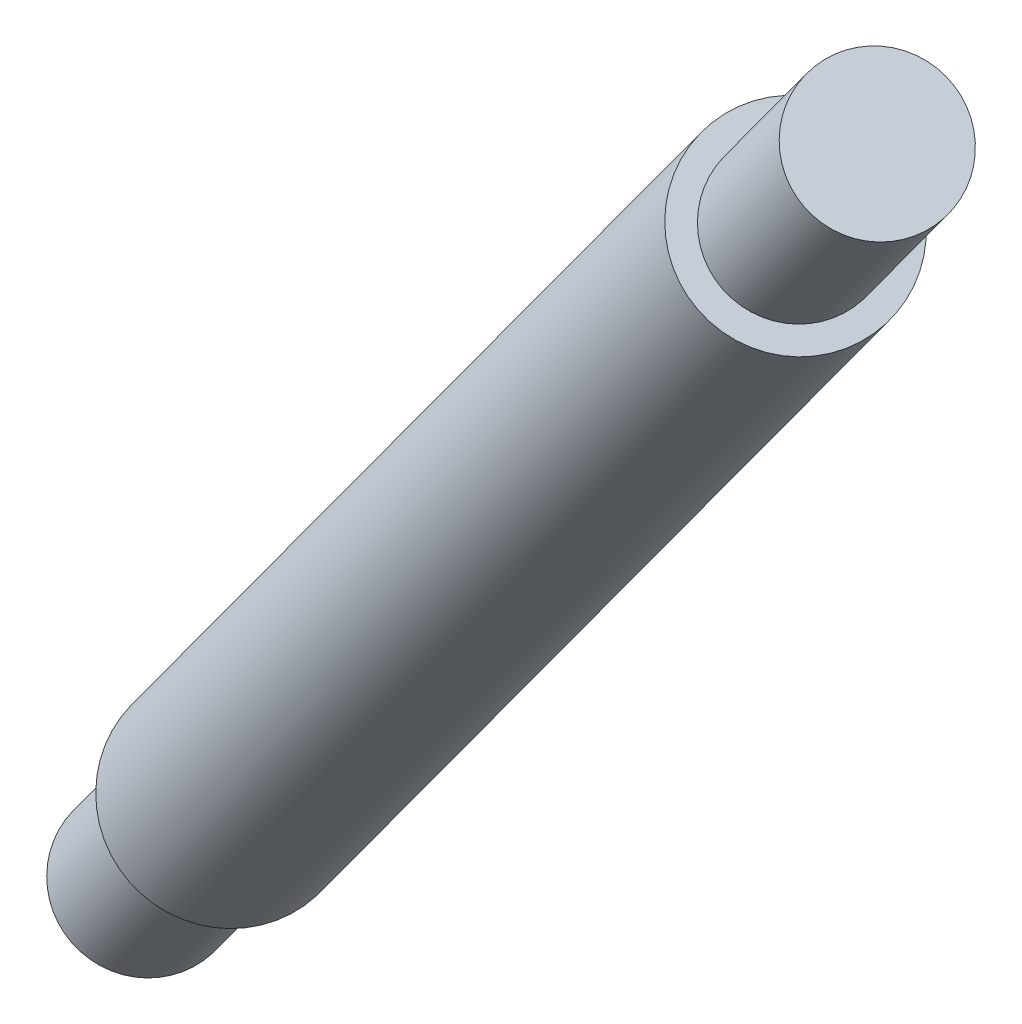
ISO-10303-21;
HEADER;
FILE_DESCRIPTION(('STEP AP214'),'2;1');
FILE_NAME('part.step','',(''),(''),'','','');
FILE_SCHEMA(('AUTOMOTIVE_DESIGN { 1 0 10303 214 1 1 1 1 }'));
ENDSEC;
DATA;
#1=APPLICATION_CONTEXT('core data for automotive mechanical design processes');
#2=APPLICATION_PROTOCOL_DEFINITION('international standard','automotive_design',2000,#1);
#3=PRODUCT_CONTEXT('',#1,'mechanical');
#4=PRODUCT('Part','Part','',(#3));
#5=PRODUCT_RELATED_PRODUCT_CATEGORY('part','',(#4));
#6=PRODUCT_DEFINITION_FORMATION('','',#4);
#7=PRODUCT_DEFINITION_CONTEXT('part definition',#1,'design');
#8=PRODUCT_DEFINITION('design','',#6,#7);
#9=PRODUCT_DEFINITION_SHAPE('','',#8);
#10=(LENGTH_UNIT() NAMED_UNIT(*) SI_UNIT(.MILLI.,.METRE.));
#11=(NAMED_UNIT(*) PLANE_ANGLE_UNIT() SI_UNIT($,.RADIAN.));
#12=(NAMED_UNIT(*) SI_UNIT($,.STERADIAN.) SOLID_ANGLE_UNIT());
#13=UNCERTAINTY_MEASURE_WITH_UNIT(LENGTH_MEASURE(1.E-05),#10,'distance_accuracy_value','');
#14=(GEOMETRIC_REPRESENTATION_CONTEXT(3) GLOBAL_UNCERTAINTY_ASSIGNED_CONTEXT((#13)) GLOBAL_UNIT_ASSIGNED_CONTEXT((#10,
#11,#12)) REPRESENTATION_CONTEXT('',''));
#15=CARTESIAN_POINT('',(0.,0.,0.));
#16=DIRECTION('',(0.,0.,1.));
#17=DIRECTION('',(1.,0.,0.));
#18=AXIS2_PLACEMENT_3D('',#15,#16,#17);
#19=CARTESIAN_POINT('',(-46.8886638637,-43.79049818765,37.05144127146));
#20=DIRECTION('',(0.61184292080542,0.707106781186001,0.354468955285318));
#21=DIRECTION('',(0.756209115171886,-0.654330019279991,0.));
#22=AXIS2_PLACEMENT_3D('',#19,#20,#21);
#23=PLANE('',#22);
#24=CARTESIAN_POINT('',(-45.3264916864481,-44.3996323749596,35.5701237529276));
#25=DIRECTION('',(0.611842920799287,0.707106781189167,0.354468955289588));
#26=DIRECTION('',(-0.75620911517658,0.654330019274565,0.));
#27=AXIS2_PLACEMENT_3D('',#24,#25,#26);
#28=CIRCLE('',#27,1.50000000002722);
#29=CARTESIAN_POINT('',(-46.4608053592335,-43.41813734603,35.5701237529276));
#30=VERTEX_POINT('',#29);
#31=EDGE_CURVE('E19',#30,#30,#28,.F.);
#32=ORIENTED_EDGE('',*,*,#31,.T.);
#33=EDGE_LOOP('',(#32));
#34=FACE_BOUND('',#33,.T.);
#35=ADVANCED_FACE('F15',(#34),#23,.F.);
#36=CARTESIAN_POINT('',(-45.3264916864481,-44.3996323749596,35.5701237529276));
#37=DIRECTION('',(0.611842920799287,0.707106781189167,0.354468955289588));
#38=DIRECTION('',(-0.75620911517658,0.654330019274565,0.));
#39=AXIS2_PLACEMENT_3D('',#36,#37,#38);
#40=CYLINDRICAL_SURFACE('',#39,1.50000000002722);
#41=CARTESIAN_POINT('',(-41.1965519710507,-39.6266616019302,37.9627892011336));
#42=DIRECTION('',(0.611842920799287,0.707106781189167,0.354468955289588));
#43=DIRECTION('',(-0.75620911517658,0.654330019274565,0.));
#44=AXIS2_PLACEMENT_3D('',#41,#42,#43);
#45=CIRCLE('',#44,1.50000000002722);
#46=CARTESIAN_POINT('',(-42.3308656438361,-38.6451665730005,37.9627892011336));
#47=VERTEX_POINT('',#46);
#48=EDGE_CURVE('E35',#47,#47,#45,.F.);
#49=ORIENTED_EDGE('',*,*,#48,.T.);
#50=EDGE_LOOP('',(#49));
#51=FACE_BOUND('',#50,.T.);
#52=ORIENTED_EDGE('',*,*,#31,.F.);
#53=EDGE_LOOP('',(#52));
#54=FACE_BOUND('',#53,.T.);
#55=ADVANCED_FACE('F43',(#51,#54),#40,.T.);
#56=CARTESIAN_POINT('',(-43.25190146152,-38.82320468432,39.90773019079));
#57=DIRECTION('',(0.611842920804027,0.707106781186744,0.354468955286241));
#58=DIRECTION('',(0.756209115172963,-0.654330019278746,0.));
#59=AXIS2_PLACEMENT_3D('',#56,#57,#58);
#60=PLANE('',#59);
#61=ORIENTED_EDGE('',*,*,#48,.F.);
#62=EDGE_LOOP('',(#61));
#63=FACE_BOUND('',#62,.T.);
#64=CARTESIAN_POINT('',(-41.1965519710507,-39.6266616019301,37.9627892011336));
#65=DIRECTION('',(0.611842920799289,0.707106781189167,0.354468955289586));
#66=DIRECTION('',(-0.756209115176579,0.654330019274567,0.));
#67=AXIS2_PLACEMENT_3D('',#64,#65,#66);
#68=CIRCLE('',#67,2.0000000001641);
#69=CARTESIAN_POINT('',(-42.7089702015279,-38.3180015632736,37.9627892011336));
#70=VERTEX_POINT('',#69);
#71=EDGE_CURVE('E33',#70,#70,#68,.F.);
#72=ORIENTED_EDGE('',*,*,#71,.T.);
#73=EDGE_LOOP('',(#72));
#74=FACE_BOUND('',#73,.T.);
#75=ADVANCED_FACE('F45',(#63,#74),#60,.F.);
#76=CARTESIAN_POINT('',(-41.1965519710507,-39.6266616019301,37.9627892011336));
#77=DIRECTION('',(0.611842920799289,0.707106781189167,0.354468955289586));
#78=DIRECTION('',(-0.756209115176579,0.654330019274567,0.));
#79=AXIS2_PLACEMENT_3D('',#76,#77,#78);
#80=CYLINDRICAL_SURFACE('',#79,2.0000000001641);
#81=CARTESIAN_POINT('',(-12.4399346934862,-6.39264288604174,54.6228300997429));
#82=DIRECTION('',(0.611842920799289,0.707106781189167,0.354468955289586));
#83=DIRECTION('',(-0.756209115176579,0.654330019274567,0.));
#84=AXIS2_PLACEMENT_3D('',#81,#82,#83);
#85=CIRCLE('',#84,2.0000000001641);
#86=CARTESIAN_POINT('',(-13.9523529239634,-5.08398284738522,54.6228300997429));
#87=VERTEX_POINT('',#86);
#88=EDGE_CURVE('E28',#87,#87,#85,.T.);
#89=ORIENTED_EDGE('',*,*,#88,.F.);
#90=EDGE_LOOP('',(#89));
#91=FACE_BOUND('',#90,.T.);
#92=ORIENTED_EDGE('',*,*,#71,.F.);
#93=EDGE_LOOP('',(#92));
#94=FACE_BOUND('',#93,.T.);
#95=ADVANCED_FACE('F52',(#91,#94),#80,.T.);
#96=CARTESIAN_POINT('',(-14.49528418375,-5.589185968545,56.56777108927));
#97=DIRECTION('',(0.611842920803703,0.707106781186626,0.354468955287036));
#98=DIRECTION('',(0.75620911517308,-0.654330019278611,0.));
#99=AXIS2_PLACEMENT_3D('',#96,#97,#98);
#100=PLANE('',#99);
#101=CARTESIAN_POINT('',(-12.4399346934853,-6.39264288604052,54.6228300997435));
#102=DIRECTION('',(0.611842920799288,0.707106781189168,0.354468955289587));
#103=DIRECTION('',(-0.756209115176581,0.654330019274565,0.));
#104=AXIS2_PLACEMENT_3D('',#101,#102,#103);
#105=CIRCLE('',#104,1.50000000029785);
#106=CARTESIAN_POINT('',(-13.5742483664754,-5.41114785693378,54.6228300997435));
#107=VERTEX_POINT('',#106);
#108=EDGE_CURVE('E23',#107,#107,#105,.F.);
#109=ORIENTED_EDGE('',*,*,#108,.T.);
#110=EDGE_LOOP('',(#109));
#111=FACE_BOUND('',#110,.T.);
#112=ORIENTED_EDGE('',*,*,#88,.T.);
#113=EDGE_LOOP('',(#112));
#114=FACE_BOUND('',#113,.T.);
#115=ADVANCED_FACE('F62',(#111,#114),#100,.T.);
#116=CARTESIAN_POINT('',(-12.4399346934853,-6.39264288604052,54.6228300997435));
#117=DIRECTION('',(0.611842920799288,0.707106781189168,0.354468955289587));
#118=DIRECTION('',(-0.756209115176581,0.654330019274565,0.));
#119=AXIS2_PLACEMENT_3D('',#116,#117,#118);
#120=CYLINDRICAL_SURFACE('',#119,1.50000000029785);
#121=CARTESIAN_POINT('',(-8.30999497808771,-1.61967211301092,57.0154955479496));
#122=DIRECTION('',(0.61184292079929,0.707106781189166,0.354468955289585));
#123=DIRECTION('',(-0.756209115176578,0.654330019274568,0.));
#124=AXIS2_PLACEMENT_3D('',#121,#122,#123);
#125=CIRCLE('',#124,1.50000000029784);
#126=CARTESIAN_POINT('',(-9.44430865107781,-0.638177083904179,57.0154955479496));
#127=VERTEX_POINT('',#126);
#128=EDGE_CURVE('E10',#127,#127,#125,.T.);
#129=ORIENTED_EDGE('',*,*,#128,.F.);
#130=EDGE_LOOP('',(#129));
#131=FACE_BOUND('',#130,.T.);
#132=ORIENTED_EDGE('',*,*,#108,.F.);
#133=EDGE_LOOP('',(#132));
#134=FACE_BOUND('',#133,.T.);
#135=ADVANCED_FACE('F58',(#131,#134),#120,.T.);
#136=CARTESIAN_POINT('',(-9.872167155079,-1.010537925859,58.49681306632));
#137=DIRECTION('',(0.611842920803509,0.707106781186596,0.354468955287431));
#138=DIRECTION('',(0.756209115173169,-0.654330019278508,0.));
#139=AXIS2_PLACEMENT_3D('',#136,#137,#138);
#140=PLANE('',#139);
#141=ORIENTED_EDGE('',*,*,#128,.T.);
#142=EDGE_LOOP('',(#141));
#143=FACE_BOUND('',#142,.T.);
#144=ADVANCED_FACE('F17',(#143),#140,.T.);
#145=CLOSED_SHELL('',(#35,#55,#75,#95,#115,#135,#144));
#146=MANIFOLD_SOLID_BREP('B1',#145);
#147=ADVANCED_BREP_SHAPE_REPRESENTATION('',(#18,#146),#14);
#148=SHAPE_DEFINITION_REPRESENTATION(#9,#147);
ENDSEC;
END-ISO-10303-21;
